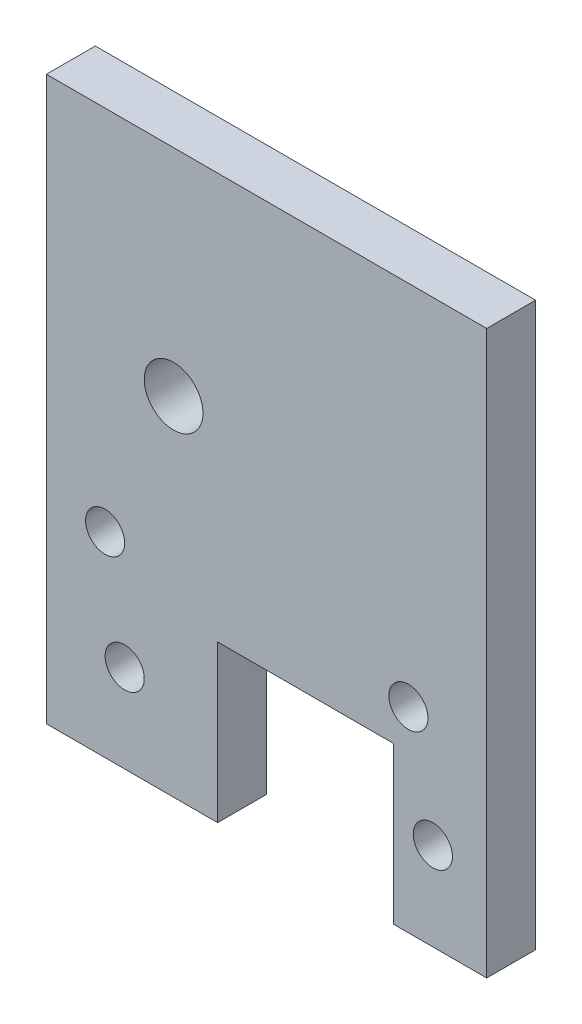
ISO-10303-21;
HEADER;
FILE_DESCRIPTION(('STEP AP214'),'2;1');
FILE_NAME('part.step','',(''),(''),'','','');
FILE_SCHEMA(('AUTOMOTIVE_DESIGN { 1 0 10303 214 1 1 1 1 }'));
ENDSEC;
DATA;
#1=APPLICATION_CONTEXT('core data for automotive mechanical design processes');
#2=APPLICATION_PROTOCOL_DEFINITION('international standard','automotive_design',2000,#1);
#3=PRODUCT_CONTEXT('',#1,'mechanical');
#4=PRODUCT('Part','Part','',(#3));
#5=PRODUCT_RELATED_PRODUCT_CATEGORY('part','',(#4));
#6=PRODUCT_DEFINITION_FORMATION('','',#4);
#7=PRODUCT_DEFINITION_CONTEXT('part definition',#1,'design');
#8=PRODUCT_DEFINITION('design','',#6,#7);
#9=PRODUCT_DEFINITION_SHAPE('','',#8);
#10=(LENGTH_UNIT() NAMED_UNIT(*) SI_UNIT(.MILLI.,.METRE.));
#11=(NAMED_UNIT(*) PLANE_ANGLE_UNIT() SI_UNIT($,.RADIAN.));
#12=(NAMED_UNIT(*) SI_UNIT($,.STERADIAN.) SOLID_ANGLE_UNIT());
#13=UNCERTAINTY_MEASURE_WITH_UNIT(LENGTH_MEASURE(1.E-05),#10,'distance_accuracy_value','');
#14=(GEOMETRIC_REPRESENTATION_CONTEXT(3) GLOBAL_UNCERTAINTY_ASSIGNED_CONTEXT((#13)) GLOBAL_UNIT_ASSIGNED_CONTEXT((#10,
#11,#12)) REPRESENTATION_CONTEXT('',''));
#15=CARTESIAN_POINT('',(0.,0.,0.));
#16=DIRECTION('',(0.,0.,1.));
#17=DIRECTION('',(1.,0.,0.));
#18=AXIS2_PLACEMENT_3D('',#15,#16,#17);
#19=CARTESIAN_POINT('',(-6.50000000000001,0.,-5.));
#20=DIRECTION('',(-1.,0.,0.));
#21=DIRECTION('',(0.,0.,1.));
#22=AXIS2_PLACEMENT_3D('',#19,#20,#21);
#23=PLANE('',#22);
#24=DIRECTION('',(0.,-1.,0.));
#25=VECTOR('',#24,1.);
#26=CARTESIAN_POINT('',(-6.50000000000001,0.,0.));
#27=LINE('',#26,#25);
#28=CARTESIAN_POINT('',(-6.50000000000001,-10.75,0.));
#29=VERTEX_POINT('',#28);
#30=CARTESIAN_POINT('',(-6.50000000000001,-26.75,0.));
#31=VERTEX_POINT('',#30);
#32=EDGE_CURVE('E165',#29,#31,#27,.T.);
#33=ORIENTED_EDGE('',*,*,#32,.T.);
#34=DIRECTION('',(0.,0.,1.));
#35=VECTOR('',#34,1.);
#36=CARTESIAN_POINT('',(-6.50000000000001,-26.75,-5.));
#37=LINE('',#36,#35);
#38=CARTESIAN_POINT('',(-6.50000000000001,-26.75,-5.));
#39=VERTEX_POINT('',#38);
#40=EDGE_CURVE('E11',#39,#31,#37,.T.);
#41=ORIENTED_EDGE('',*,*,#40,.F.);
#42=DIRECTION('',(0.,-1.,0.));
#43=VECTOR('',#42,1.);
#44=CARTESIAN_POINT('',(-6.50000000000001,0.,-5.));
#45=LINE('',#44,#43);
#46=CARTESIAN_POINT('',(-6.50000000000001,-10.75,-5.));
#47=VERTEX_POINT('',#46);
#48=EDGE_CURVE('E64',#47,#39,#45,.T.);
#49=ORIENTED_EDGE('',*,*,#48,.F.);
#50=DIRECTION('',(0.,0.,1.));
#51=VECTOR('',#50,1.);
#52=CARTESIAN_POINT('',(-6.50000000000001,-10.75,-5.));
#53=LINE('',#52,#51);
#54=EDGE_CURVE('E48',#47,#29,#53,.T.);
#55=ORIENTED_EDGE('',*,*,#54,.T.);
#56=EDGE_LOOP('',(#33,#41,#49,#55));
#57=FACE_BOUND('',#56,.T.);
#58=ADVANCED_FACE('F45',(#57),#23,.F.);
#59=CARTESIAN_POINT('',(0.,-26.75,-5.));
#60=DIRECTION('',(0.,-1.,0.));
#61=DIRECTION('',(0.,0.,-1.));
#62=AXIS2_PLACEMENT_3D('',#59,#60,#61);
#63=PLANE('',#62);
#64=DIRECTION('',(1.,0.,0.));
#65=VECTOR('',#64,1.);
#66=CARTESIAN_POINT('',(0.,-26.75,0.));
#67=LINE('',#66,#65);
#68=CARTESIAN_POINT('',(-24.,-26.75,0.));
#69=VERTEX_POINT('',#68);
#70=EDGE_CURVE('E189',#69,#31,#67,.T.);
#71=ORIENTED_EDGE('',*,*,#70,.F.);
#72=DIRECTION('',(0.,0.,1.));
#73=VECTOR('',#72,1.);
#74=CARTESIAN_POINT('',(-24.,-26.75,-5.));
#75=LINE('',#74,#73);
#76=CARTESIAN_POINT('',(-24.,-26.75,-5.));
#77=VERTEX_POINT('',#76);
#78=EDGE_CURVE('E55',#77,#69,#75,.T.);
#79=ORIENTED_EDGE('',*,*,#78,.F.);
#80=DIRECTION('',(1.,0.,0.));
#81=VECTOR('',#80,1.);
#82=CARTESIAN_POINT('',(0.,-26.75,-5.));
#83=LINE('',#82,#81);
#84=EDGE_CURVE('E138',#77,#39,#83,.T.);
#85=ORIENTED_EDGE('',*,*,#84,.T.);
#86=ORIENTED_EDGE('',*,*,#40,.T.);
#87=EDGE_LOOP('',(#71,#79,#85,#86));
#88=FACE_BOUND('',#87,.T.);
#89=ADVANCED_FACE('F246',(#88),#63,.T.);
#90=CARTESIAN_POINT('',(-24.,0.,-5.));
#91=DIRECTION('',(-1.,0.,0.));
#92=DIRECTION('',(0.,-1.,0.));
#93=AXIS2_PLACEMENT_3D('',#90,#91,#92);
#94=PLANE('',#93);
#95=DIRECTION('',(0.,-1.,0.));
#96=VECTOR('',#95,1.);
#97=CARTESIAN_POINT('',(-24.,0.,0.));
#98=LINE('',#97,#96);
#99=CARTESIAN_POINT('',(-24.,30.75,0.));
#100=VERTEX_POINT('',#99);
#101=EDGE_CURVE('E122',#100,#69,#98,.T.);
#102=ORIENTED_EDGE('',*,*,#101,.F.);
#103=DIRECTION('',(0.,0.,1.));
#104=VECTOR('',#103,1.);
#105=CARTESIAN_POINT('',(-24.,30.75,-5.));
#106=LINE('',#105,#104);
#107=CARTESIAN_POINT('',(-24.,30.75,-5.));
#108=VERTEX_POINT('',#107);
#109=EDGE_CURVE('E117',#108,#100,#106,.T.);
#110=ORIENTED_EDGE('',*,*,#109,.F.);
#111=DIRECTION('',(0.,-1.,0.));
#112=VECTOR('',#111,1.);
#113=CARTESIAN_POINT('',(-24.,0.,-5.));
#114=LINE('',#113,#112);
#115=EDGE_CURVE('E121',#108,#77,#114,.T.);
#116=ORIENTED_EDGE('',*,*,#115,.T.);
#117=ORIENTED_EDGE('',*,*,#78,.T.);
#118=EDGE_LOOP('',(#102,#110,#116,#117));
#119=FACE_BOUND('',#118,.T.);
#120=ADVANCED_FACE('F119',(#119),#94,.T.);
#121=CARTESIAN_POINT('',(0.,30.75,-5.));
#122=DIRECTION('',(0.,-1.,0.));
#123=DIRECTION('',(1.,0.,0.));
#124=AXIS2_PLACEMENT_3D('',#121,#122,#123);
#125=PLANE('',#124);
#126=DIRECTION('',(1.,0.,0.));
#127=VECTOR('',#126,1.);
#128=CARTESIAN_POINT('',(0.,30.75,0.));
#129=LINE('',#128,#127);
#130=CARTESIAN_POINT('',(21.,30.75,0.));
#131=VERTEX_POINT('',#130);
#132=EDGE_CURVE('E184',#100,#131,#129,.T.);
#133=ORIENTED_EDGE('',*,*,#132,.T.);
#134=DIRECTION('',(0.,0.,1.));
#135=VECTOR('',#134,1.);
#136=CARTESIAN_POINT('',(21.,30.75,-5.));
#137=LINE('',#136,#135);
#138=CARTESIAN_POINT('',(21.,30.75,-5.));
#139=VERTEX_POINT('',#138);
#140=EDGE_CURVE('E126',#139,#131,#137,.T.);
#141=ORIENTED_EDGE('',*,*,#140,.F.);
#142=DIRECTION('',(1.,0.,0.));
#143=VECTOR('',#142,1.);
#144=CARTESIAN_POINT('',(0.,30.75,-5.));
#145=LINE('',#144,#143);
#146=EDGE_CURVE('E129',#108,#139,#145,.T.);
#147=ORIENTED_EDGE('',*,*,#146,.F.);
#148=ORIENTED_EDGE('',*,*,#109,.T.);
#149=EDGE_LOOP('',(#133,#141,#147,#148));
#150=FACE_BOUND('',#149,.T.);
#151=ADVANCED_FACE('F130',(#150),#125,.F.);
#152=CARTESIAN_POINT('',(21.,0.,-5.));
#153=DIRECTION('',(-1.,0.,0.));
#154=DIRECTION('',(0.,-1.,0.));
#155=AXIS2_PLACEMENT_3D('',#152,#153,#154);
#156=PLANE('',#155);
#157=DIRECTION('',(0.,-1.,0.));
#158=VECTOR('',#157,1.);
#159=CARTESIAN_POINT('',(21.,0.,0.));
#160=LINE('',#159,#158);
#161=CARTESIAN_POINT('',(21.,-26.75,0.));
#162=VERTEX_POINT('',#161);
#163=EDGE_CURVE('E180',#131,#162,#160,.T.);
#164=ORIENTED_EDGE('',*,*,#163,.T.);
#165=DIRECTION('',(0.,0.,1.));
#166=VECTOR('',#165,1.);
#167=CARTESIAN_POINT('',(21.,-26.75,-5.));
#168=LINE('',#167,#166);
#169=CARTESIAN_POINT('',(21.,-26.75,-5.));
#170=VERTEX_POINT('',#169);
#171=EDGE_CURVE('E217',#170,#162,#168,.T.);
#172=ORIENTED_EDGE('',*,*,#171,.F.);
#173=DIRECTION('',(0.,-1.,0.));
#174=VECTOR('',#173,1.);
#175=CARTESIAN_POINT('',(21.,0.,-5.));
#176=LINE('',#175,#174);
#177=EDGE_CURVE('E134',#139,#170,#176,.T.);
#178=ORIENTED_EDGE('',*,*,#177,.F.);
#179=ORIENTED_EDGE('',*,*,#140,.T.);
#180=EDGE_LOOP('',(#164,#172,#178,#179));
#181=FACE_BOUND('',#180,.T.);
#182=ADVANCED_FACE('F259',(#181),#156,.F.);
#183=CARTESIAN_POINT('',(0.,-26.75,-5.));
#184=DIRECTION('',(0.,-1.,0.));
#185=DIRECTION('',(0.,0.,-1.));
#186=AXIS2_PLACEMENT_3D('',#183,#184,#185);
#187=PLANE('',#186);
#188=DIRECTION('',(1.,0.,0.));
#189=VECTOR('',#188,1.);
#190=CARTESIAN_POINT('',(0.,-26.75,0.));
#191=LINE('',#190,#189);
#192=CARTESIAN_POINT('',(11.5,-26.75,0.));
#193=VERTEX_POINT('',#192);
#194=EDGE_CURVE('E176',#193,#162,#191,.T.);
#195=ORIENTED_EDGE('',*,*,#194,.F.);
#196=DIRECTION('',(0.,0.,1.));
#197=VECTOR('',#196,1.);
#198=CARTESIAN_POINT('',(11.5,-26.75,-5.));
#199=LINE('',#198,#197);
#200=CARTESIAN_POINT('',(11.5,-26.75,-5.));
#201=VERTEX_POINT('',#200);
#202=EDGE_CURVE('E220',#201,#193,#199,.T.);
#203=ORIENTED_EDGE('',*,*,#202,.F.);
#204=DIRECTION('',(1.,0.,0.));
#205=VECTOR('',#204,1.);
#206=CARTESIAN_POINT('',(0.,-26.75,-5.));
#207=LINE('',#206,#205);
#208=EDGE_CURVE('E283',#201,#170,#207,.T.);
#209=ORIENTED_EDGE('',*,*,#208,.T.);
#210=ORIENTED_EDGE('',*,*,#171,.T.);
#211=EDGE_LOOP('',(#195,#203,#209,#210));
#212=FACE_BOUND('',#211,.T.);
#213=ADVANCED_FACE('F262',(#212),#187,.T.);
#214=CARTESIAN_POINT('',(11.5,0.,-5.));
#215=DIRECTION('',(-1.,0.,0.));
#216=DIRECTION('',(0.,0.,1.));
#217=AXIS2_PLACEMENT_3D('',#214,#215,#216);
#218=PLANE('',#217);
#219=DIRECTION('',(0.,-1.,0.));
#220=VECTOR('',#219,1.);
#221=CARTESIAN_POINT('',(11.5,0.,0.));
#222=LINE('',#221,#220);
#223=CARTESIAN_POINT('',(11.5,-10.75,0.));
#224=VERTEX_POINT('',#223);
#225=EDGE_CURVE('E172',#224,#193,#222,.T.);
#226=ORIENTED_EDGE('',*,*,#225,.F.);
#227=DIRECTION('',(0.,0.,1.));
#228=VECTOR('',#227,1.);
#229=CARTESIAN_POINT('',(11.5,-10.75,-5.));
#230=LINE('',#229,#228);
#231=CARTESIAN_POINT('',(11.5,-10.75,-5.));
#232=VERTEX_POINT('',#231);
#233=EDGE_CURVE('E222',#232,#224,#230,.T.);
#234=ORIENTED_EDGE('',*,*,#233,.F.);
#235=DIRECTION('',(0.,-1.,0.));
#236=VECTOR('',#235,1.);
#237=CARTESIAN_POINT('',(11.5,0.,-5.));
#238=LINE('',#237,#236);
#239=EDGE_CURVE('E286',#232,#201,#238,.T.);
#240=ORIENTED_EDGE('',*,*,#239,.T.);
#241=ORIENTED_EDGE('',*,*,#202,.T.);
#242=EDGE_LOOP('',(#226,#234,#240,#241));
#243=FACE_BOUND('',#242,.T.);
#244=ADVANCED_FACE('F265',(#243),#218,.T.);
#245=CARTESIAN_POINT('',(-16.,-17.75,-5.));
#246=DIRECTION('',(0.,0.,1.));
#247=DIRECTION('',(1.,0.,0.));
#248=AXIS2_PLACEMENT_3D('',#245,#246,#247);
#249=CYLINDRICAL_SURFACE('',#248,2.);
#250=CARTESIAN_POINT('',(-16.,-17.75,-5.));
#251=DIRECTION('',(0.,0.,1.));
#252=DIRECTION('',(1.,0.,0.));
#253=AXIS2_PLACEMENT_3D('',#250,#251,#252);
#254=CIRCLE('',#253,2.);
#255=CARTESIAN_POINT('',(-14.,-17.75,-5.));
#256=VERTEX_POINT('',#255);
#257=EDGE_CURVE('E157',#256,#256,#254,.T.);
#258=ORIENTED_EDGE('',*,*,#257,.F.);
#259=EDGE_LOOP('',(#258));
#260=FACE_BOUND('',#259,.T.);
#261=CARTESIAN_POINT('',(-16.,-17.75,0.));
#262=DIRECTION('',(0.,0.,1.));
#263=DIRECTION('',(1.,0.,0.));
#264=AXIS2_PLACEMENT_3D('',#261,#262,#263);
#265=CIRCLE('',#264,2.);
#266=CARTESIAN_POINT('',(-14.,-17.75,0.));
#267=VERTEX_POINT('',#266);
#268=EDGE_CURVE('E205',#267,#267,#265,.T.);
#269=ORIENTED_EDGE('',*,*,#268,.T.);
#270=EDGE_LOOP('',(#269));
#271=FACE_BOUND('',#270,.T.);
#272=ADVANCED_FACE('F268',(#260,#271),#249,.F.);
#273=CARTESIAN_POINT('',(-11.,8.75,-5.));
#274=DIRECTION('',(0.,0.,1.));
#275=DIRECTION('',(1.,0.,0.));
#276=AXIS2_PLACEMENT_3D('',#273,#274,#275);
#277=CYLINDRICAL_SURFACE('',#276,3.);
#278=CARTESIAN_POINT('',(-11.,8.75,-5.));
#279=DIRECTION('',(0.,0.,1.));
#280=DIRECTION('',(1.,0.,0.));
#281=AXIS2_PLACEMENT_3D('',#278,#279,#280);
#282=CIRCLE('',#281,3.);
#283=CARTESIAN_POINT('',(-7.99999999999999,8.75,-5.));
#284=VERTEX_POINT('',#283);
#285=EDGE_CURVE('E153',#284,#284,#282,.T.);
#286=ORIENTED_EDGE('',*,*,#285,.F.);
#287=EDGE_LOOP('',(#286));
#288=FACE_BOUND('',#287,.T.);
#289=CARTESIAN_POINT('',(-11.,8.75,0.));
#290=DIRECTION('',(0.,0.,1.));
#291=DIRECTION('',(1.,0.,0.));
#292=AXIS2_PLACEMENT_3D('',#289,#290,#291);
#293=CIRCLE('',#292,3.);
#294=CARTESIAN_POINT('',(-7.99999999999999,8.75,0.));
#295=VERTEX_POINT('',#294);
#296=EDGE_CURVE('E201',#295,#295,#293,.T.);
#297=ORIENTED_EDGE('',*,*,#296,.T.);
#298=EDGE_LOOP('',(#297));
#299=FACE_BOUND('',#298,.T.);
#300=ADVANCED_FACE('F273',(#288,#299),#277,.F.);
#301=CARTESIAN_POINT('',(-18.,-6.75,-5.));
#302=DIRECTION('',(0.,0.,1.));
#303=DIRECTION('',(1.,0.,0.));
#304=AXIS2_PLACEMENT_3D('',#301,#302,#303);
#305=CYLINDRICAL_SURFACE('',#304,2.);
#306=CARTESIAN_POINT('',(-18.,-6.75,-5.));
#307=DIRECTION('',(0.,0.,1.));
#308=DIRECTION('',(1.,0.,0.));
#309=AXIS2_PLACEMENT_3D('',#306,#307,#308);
#310=CIRCLE('',#309,2.);
#311=CARTESIAN_POINT('',(-16.,-6.75,-5.));
#312=VERTEX_POINT('',#311);
#313=EDGE_CURVE('E149',#312,#312,#310,.T.);
#314=ORIENTED_EDGE('',*,*,#313,.F.);
#315=EDGE_LOOP('',(#314));
#316=FACE_BOUND('',#315,.T.);
#317=CARTESIAN_POINT('',(-18.,-6.75,0.));
#318=DIRECTION('',(0.,0.,1.));
#319=DIRECTION('',(1.,0.,0.));
#320=AXIS2_PLACEMENT_3D('',#317,#318,#319);
#321=CIRCLE('',#320,2.);
#322=CARTESIAN_POINT('',(-16.,-6.75,0.));
#323=VERTEX_POINT('',#322);
#324=EDGE_CURVE('E197',#323,#323,#321,.T.);
#325=ORIENTED_EDGE('',*,*,#324,.T.);
#326=EDGE_LOOP('',(#325));
#327=FACE_BOUND('',#326,.T.);
#328=ADVANCED_FACE('F241',(#316,#327),#305,.F.);
#329=CARTESIAN_POINT('',(13.,-6.75,-5.));
#330=DIRECTION('',(0.,0.,1.));
#331=DIRECTION('',(1.,0.,0.));
#332=AXIS2_PLACEMENT_3D('',#329,#330,#331);
#333=CYLINDRICAL_SURFACE('',#332,2.);
#334=CARTESIAN_POINT('',(13.,-6.75,-5.));
#335=DIRECTION('',(0.,0.,1.));
#336=DIRECTION('',(1.,0.,0.));
#337=AXIS2_PLACEMENT_3D('',#334,#335,#336);
#338=CIRCLE('',#337,2.);
#339=CARTESIAN_POINT('',(15.,-6.75,-5.));
#340=VERTEX_POINT('',#339);
#341=EDGE_CURVE('E142',#340,#340,#338,.T.);
#342=ORIENTED_EDGE('',*,*,#341,.F.);
#343=EDGE_LOOP('',(#342));
#344=FACE_BOUND('',#343,.T.);
#345=CARTESIAN_POINT('',(13.,-6.75,0.));
#346=DIRECTION('',(0.,0.,1.));
#347=DIRECTION('',(1.,0.,0.));
#348=AXIS2_PLACEMENT_3D('',#345,#346,#347);
#349=CIRCLE('',#348,2.);
#350=CARTESIAN_POINT('',(15.,-6.75,0.));
#351=VERTEX_POINT('',#350);
#352=EDGE_CURVE('E193',#351,#351,#349,.T.);
#353=ORIENTED_EDGE('',*,*,#352,.T.);
#354=EDGE_LOOP('',(#353));
#355=FACE_BOUND('',#354,.T.);
#356=ADVANCED_FACE('F234',(#344,#355),#333,.F.);
#357=CARTESIAN_POINT('',(0.,-10.75,-5.));
#358=DIRECTION('',(0.,-1.,0.));
#359=DIRECTION('',(0.,0.,-1.));
#360=AXIS2_PLACEMENT_3D('',#357,#358,#359);
#361=PLANE('',#360);
#362=DIRECTION('',(1.,0.,0.));
#363=VECTOR('',#362,1.);
#364=CARTESIAN_POINT('',(0.,-10.75,0.));
#365=LINE('',#364,#363);
#366=EDGE_CURVE('E168',#29,#224,#365,.T.);
#367=ORIENTED_EDGE('',*,*,#366,.F.);
#368=ORIENTED_EDGE('',*,*,#54,.F.);
#369=DIRECTION('',(1.,0.,0.));
#370=VECTOR('',#369,1.);
#371=CARTESIAN_POINT('',(0.,-10.75,-5.));
#372=LINE('',#371,#370);
#373=EDGE_CURVE('E291',#47,#232,#372,.T.);
#374=ORIENTED_EDGE('',*,*,#373,.T.);
#375=ORIENTED_EDGE('',*,*,#233,.T.);
#376=EDGE_LOOP('',(#367,#368,#374,#375));
#377=FACE_BOUND('',#376,.T.);
#378=ADVANCED_FACE('F231',(#377),#361,.T.);
#379=CARTESIAN_POINT('',(15.5,-17.75,-5.));
#380=DIRECTION('',(0.,0.,1.));
#381=DIRECTION('',(1.,0.,0.));
#382=AXIS2_PLACEMENT_3D('',#379,#380,#381);
#383=CYLINDRICAL_SURFACE('',#382,2.);
#384=CARTESIAN_POINT('',(15.5,-17.75,-5.));
#385=DIRECTION('',(0.,0.,1.));
#386=DIRECTION('',(1.,0.,0.));
#387=AXIS2_PLACEMENT_3D('',#384,#385,#386);
#388=CIRCLE('',#387,2.);
#389=CARTESIAN_POINT('',(17.5,-17.75,-5.));
#390=VERTEX_POINT('',#389);
#391=EDGE_CURVE('E161',#390,#390,#388,.T.);
#392=ORIENTED_EDGE('',*,*,#391,.F.);
#393=EDGE_LOOP('',(#392));
#394=FACE_BOUND('',#393,.T.);
#395=CARTESIAN_POINT('',(15.5,-17.75,0.));
#396=DIRECTION('',(0.,0.,1.));
#397=DIRECTION('',(1.,0.,0.));
#398=AXIS2_PLACEMENT_3D('',#395,#396,#397);
#399=CIRCLE('',#398,2.);
#400=CARTESIAN_POINT('',(17.5,-17.75,0.));
#401=VERTEX_POINT('',#400);
#402=EDGE_CURVE('E209',#401,#401,#399,.T.);
#403=ORIENTED_EDGE('',*,*,#402,.T.);
#404=EDGE_LOOP('',(#403));
#405=FACE_BOUND('',#404,.T.);
#406=ADVANCED_FACE('F233',(#394,#405),#383,.F.);
#407=CARTESIAN_POINT('',(0.,0.,-5.));
#408=DIRECTION('',(0.,0.,1.));
#409=DIRECTION('',(1.,0.,0.));
#410=AXIS2_PLACEMENT_3D('',#407,#408,#409);
#411=PLANE('',#410);
#412=ORIENTED_EDGE('',*,*,#48,.T.);
#413=ORIENTED_EDGE('',*,*,#84,.F.);
#414=ORIENTED_EDGE('',*,*,#115,.F.);
#415=ORIENTED_EDGE('',*,*,#146,.T.);
#416=ORIENTED_EDGE('',*,*,#177,.T.);
#417=ORIENTED_EDGE('',*,*,#208,.F.);
#418=ORIENTED_EDGE('',*,*,#239,.F.);
#419=ORIENTED_EDGE('',*,*,#373,.F.);
#420=EDGE_LOOP('',(#412,#413,#414,#415,#416,#417,#418,#419));
#421=FACE_BOUND('',#420,.T.);
#422=ORIENTED_EDGE('',*,*,#341,.T.);
#423=EDGE_LOOP('',(#422));
#424=FACE_BOUND('',#423,.T.);
#425=ORIENTED_EDGE('',*,*,#313,.T.);
#426=EDGE_LOOP('',(#425));
#427=FACE_BOUND('',#426,.T.);
#428=ORIENTED_EDGE('',*,*,#285,.T.);
#429=EDGE_LOOP('',(#428));
#430=FACE_BOUND('',#429,.T.);
#431=ORIENTED_EDGE('',*,*,#257,.T.);
#432=EDGE_LOOP('',(#431));
#433=FACE_BOUND('',#432,.T.);
#434=ORIENTED_EDGE('',*,*,#391,.T.);
#435=EDGE_LOOP('',(#434));
#436=FACE_BOUND('',#435,.T.);
#437=ADVANCED_FACE('F136',(#421,#424,#427,#430,#433,#436),#411,.F.);
#438=CARTESIAN_POINT('',(0.,0.,0.));
#439=DIRECTION('',(0.,0.,1.));
#440=DIRECTION('',(1.,0.,0.));
#441=AXIS2_PLACEMENT_3D('',#438,#439,#440);
#442=PLANE('',#441);
#443=ORIENTED_EDGE('',*,*,#32,.F.);
#444=ORIENTED_EDGE('',*,*,#366,.T.);
#445=ORIENTED_EDGE('',*,*,#225,.T.);
#446=ORIENTED_EDGE('',*,*,#194,.T.);
#447=ORIENTED_EDGE('',*,*,#163,.F.);
#448=ORIENTED_EDGE('',*,*,#132,.F.);
#449=ORIENTED_EDGE('',*,*,#101,.T.);
#450=ORIENTED_EDGE('',*,*,#70,.T.);
#451=EDGE_LOOP('',(#443,#444,#445,#446,#447,#448,#449,#450));
#452=FACE_BOUND('',#451,.T.);
#453=ORIENTED_EDGE('',*,*,#352,.F.);
#454=EDGE_LOOP('',(#453));
#455=FACE_BOUND('',#454,.T.);
#456=ORIENTED_EDGE('',*,*,#324,.F.);
#457=EDGE_LOOP('',(#456));
#458=FACE_BOUND('',#457,.T.);
#459=ORIENTED_EDGE('',*,*,#296,.F.);
#460=EDGE_LOOP('',(#459));
#461=FACE_BOUND('',#460,.T.);
#462=ORIENTED_EDGE('',*,*,#268,.F.);
#463=EDGE_LOOP('',(#462));
#464=FACE_BOUND('',#463,.T.);
#465=ORIENTED_EDGE('',*,*,#402,.F.);
#466=EDGE_LOOP('',(#465));
#467=FACE_BOUND('',#466,.T.);
#468=ADVANCED_FACE('F229',(#452,#455,#458,#461,#464,#467),#442,.T.);
#469=CLOSED_SHELL('',(#58,#89,#120,#151,#182,#213,#244,#272,#300,#328,#356,#378,#406,#437,#468));
#470=MANIFOLD_SOLID_BREP('B2',#469);
#471=ADVANCED_BREP_SHAPE_REPRESENTATION('',(#18,#470),#14);
#472=SHAPE_DEFINITION_REPRESENTATION(#9,#471);
ENDSEC;
END-ISO-10303-21;
